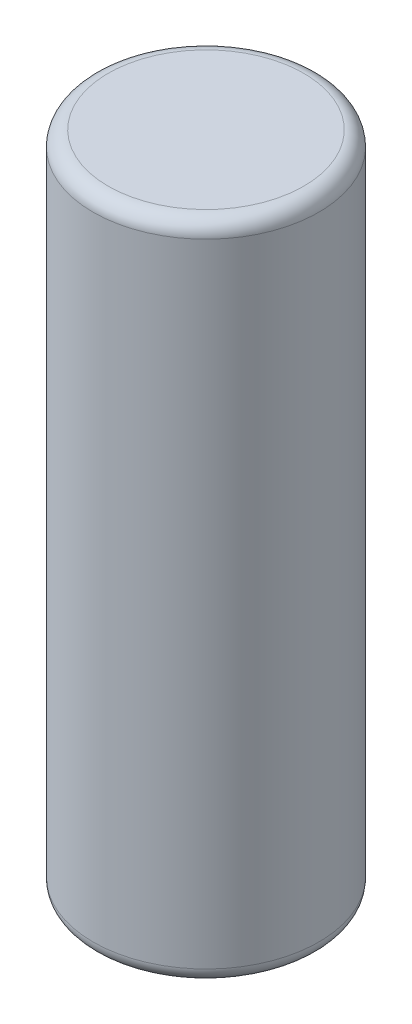
ISO-10303-21;
HEADER;
FILE_DESCRIPTION(('STEP AP214'),'2;1');
FILE_NAME('part.step','',(''),(''),'','','');
FILE_SCHEMA(('AUTOMOTIVE_DESIGN { 1 0 10303 214 1 1 1 1 }'));
ENDSEC;
DATA;
#1=APPLICATION_CONTEXT('core data for automotive mechanical design processes');
#2=APPLICATION_PROTOCOL_DEFINITION('international standard','automotive_design',2000,#1);
#3=PRODUCT_CONTEXT('',#1,'mechanical');
#4=PRODUCT('Part','Part','',(#3));
#5=PRODUCT_RELATED_PRODUCT_CATEGORY('part','',(#4));
#6=PRODUCT_DEFINITION_FORMATION('','',#4);
#7=PRODUCT_DEFINITION_CONTEXT('part definition',#1,'design');
#8=PRODUCT_DEFINITION('design','',#6,#7);
#9=PRODUCT_DEFINITION_SHAPE('','',#8);
#10=(LENGTH_UNIT() NAMED_UNIT(*) SI_UNIT(.MILLI.,.METRE.));
#11=(NAMED_UNIT(*) PLANE_ANGLE_UNIT() SI_UNIT($,.RADIAN.));
#12=(NAMED_UNIT(*) SI_UNIT($,.STERADIAN.) SOLID_ANGLE_UNIT());
#13=UNCERTAINTY_MEASURE_WITH_UNIT(LENGTH_MEASURE(1.E-05),#10,'distance_accuracy_value','');
#14=(GEOMETRIC_REPRESENTATION_CONTEXT(3) GLOBAL_UNCERTAINTY_ASSIGNED_CONTEXT((#13)) GLOBAL_UNIT_ASSIGNED_CONTEXT((#10,
#11,#12)) REPRESENTATION_CONTEXT('',''));
#15=CARTESIAN_POINT('',(0.,0.,0.));
#16=DIRECTION('',(0.,0.,1.));
#17=DIRECTION('',(1.,0.,0.));
#18=AXIS2_PLACEMENT_3D('',#15,#16,#17);
#19=CARTESIAN_POINT('',(0.,440.,0.));
#20=DIRECTION('',(0.,-1.,0.));
#21=DIRECTION('',(0.,0.,-1.));
#22=AXIS2_PLACEMENT_3D('',#19,#20,#21);
#23=CYLINDRICAL_SURFACE('',#22,75.);
#24=CARTESIAN_POINT('',(0.,10.,0.));
#25=DIRECTION('',(0.,1.,0.));
#26=DIRECTION('',(0.,0.,1.));
#27=AXIS2_PLACEMENT_3D('',#24,#25,#26);
#28=CIRCLE('',#27,75.);
#29=CARTESIAN_POINT('',(0.,10.,75.));
#30=VERTEX_POINT('',#29);
#31=EDGE_CURVE('E42',#30,#30,#28,.T.);
#32=ORIENTED_EDGE('',*,*,#31,.T.);
#33=EDGE_LOOP('',(#32));
#34=FACE_BOUND('',#33,.T.);
#35=CARTESIAN_POINT('',(0.,430.,0.));
#36=DIRECTION('',(0.,1.,0.));
#37=DIRECTION('',(0.,0.,1.));
#38=AXIS2_PLACEMENT_3D('',#35,#36,#37);
#39=CIRCLE('',#38,75.);
#40=CARTESIAN_POINT('',(0.,430.,75.));
#41=VERTEX_POINT('',#40);
#42=EDGE_CURVE('E46',#41,#41,#39,.F.);
#43=ORIENTED_EDGE('',*,*,#42,.T.);
#44=EDGE_LOOP('',(#43));
#45=FACE_BOUND('',#44,.T.);
#46=ADVANCED_FACE('F31',(#34,#45),#23,.T.);
#47=CARTESIAN_POINT('',(0.,440.,0.));
#48=DIRECTION('',(0.,1.,0.));
#49=DIRECTION('',(0.,0.,1.));
#50=AXIS2_PLACEMENT_3D('',#47,#48,#49);
#51=PLANE('',#50);
#52=CARTESIAN_POINT('',(0.,440.,0.));
#53=DIRECTION('',(0.,1.,0.));
#54=DIRECTION('',(0.,0.,1.));
#55=AXIS2_PLACEMENT_3D('',#52,#53,#54);
#56=CIRCLE('',#55,65.);
#57=CARTESIAN_POINT('',(0.,440.,65.));
#58=VERTEX_POINT('',#57);
#59=EDGE_CURVE('E10',#58,#58,#56,.T.);
#60=ORIENTED_EDGE('',*,*,#59,.T.);
#61=EDGE_LOOP('',(#60));
#62=FACE_BOUND('',#61,.T.);
#63=ADVANCED_FACE('F62',(#62),#51,.T.);
#64=CARTESIAN_POINT('',(0.,0.,0.));
#65=DIRECTION('',(0.,1.,0.));
#66=DIRECTION('',(0.,0.,1.));
#67=AXIS2_PLACEMENT_3D('',#64,#65,#66);
#68=PLANE('',#67);
#69=CARTESIAN_POINT('',(0.,0.,0.));
#70=DIRECTION('',(0.,1.,0.));
#71=DIRECTION('',(0.,0.,1.));
#72=AXIS2_PLACEMENT_3D('',#69,#70,#71);
#73=CIRCLE('',#72,65.);
#74=CARTESIAN_POINT('',(0.,0.,65.));
#75=VERTEX_POINT('',#74);
#76=EDGE_CURVE('E38',#75,#75,#73,.F.);
#77=ORIENTED_EDGE('',*,*,#76,.T.);
#78=EDGE_LOOP('',(#77));
#79=FACE_BOUND('',#78,.T.);
#80=ADVANCED_FACE('F59',(#79),#68,.F.);
#81=CARTESIAN_POINT('',(0.,10.,0.));
#82=DIRECTION('',(0.,1.,0.));
#83=DIRECTION('',(0.,0.,1.));
#84=AXIS2_PLACEMENT_3D('',#81,#82,#83);
#85=TOROIDAL_SURFACE('',#84,65.,10.);
#86=ORIENTED_EDGE('',*,*,#76,.F.);
#87=EDGE_LOOP('',(#86));
#88=FACE_BOUND('',#87,.T.);
#89=ORIENTED_EDGE('',*,*,#31,.F.);
#90=EDGE_LOOP('',(#89));
#91=FACE_BOUND('',#90,.T.);
#92=ADVANCED_FACE('F55',(#88,#91),#85,.T.);
#93=CARTESIAN_POINT('',(0.,430.,0.));
#94=DIRECTION('',(0.,1.,0.));
#95=DIRECTION('',(0.,0.,1.));
#96=AXIS2_PLACEMENT_3D('',#93,#94,#95);
#97=TOROIDAL_SURFACE('',#96,65.,10.);
#98=ORIENTED_EDGE('',*,*,#42,.F.);
#99=EDGE_LOOP('',(#98));
#100=FACE_BOUND('',#99,.T.);
#101=ORIENTED_EDGE('',*,*,#59,.F.);
#102=EDGE_LOOP('',(#101));
#103=FACE_BOUND('',#102,.T.);
#104=ADVANCED_FACE('F33',(#100,#103),#97,.T.);
#105=CLOSED_SHELL('',(#46,#63,#80,#92,#104));
#106=MANIFOLD_SOLID_BREP('B2',#105);
#107=ADVANCED_BREP_SHAPE_REPRESENTATION('',(#18,#106),#14);
#108=SHAPE_DEFINITION_REPRESENTATION(#9,#107);
ENDSEC;
END-ISO-10303-21;
